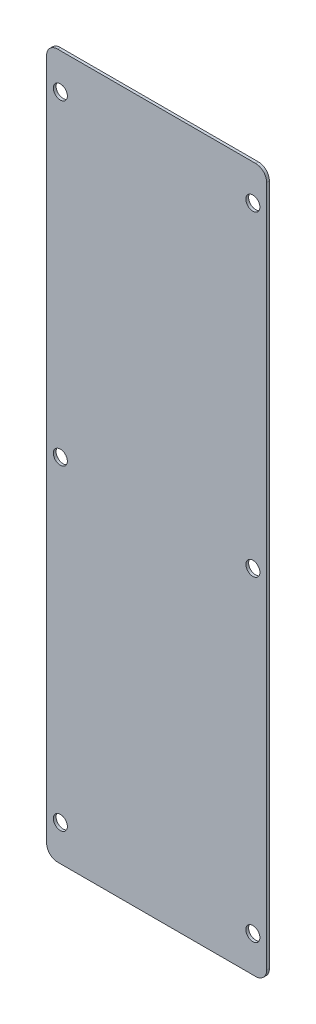
ISO-10303-21;
HEADER;
FILE_DESCRIPTION(('STEP AP214'),'2;1');
FILE_NAME('part.step','',(''),(''),'','','');
FILE_SCHEMA(('AUTOMOTIVE_DESIGN { 1 0 10303 214 1 1 1 1 }'));
ENDSEC;
DATA;
#1=APPLICATION_CONTEXT('core data for automotive mechanical design processes');
#2=APPLICATION_PROTOCOL_DEFINITION('international standard','automotive_design',2000,#1);
#3=PRODUCT_CONTEXT('',#1,'mechanical');
#4=PRODUCT('Part','Part','',(#3));
#5=PRODUCT_RELATED_PRODUCT_CATEGORY('part','',(#4));
#6=PRODUCT_DEFINITION_FORMATION('','',#4);
#7=PRODUCT_DEFINITION_CONTEXT('part definition',#1,'design');
#8=PRODUCT_DEFINITION('design','',#6,#7);
#9=PRODUCT_DEFINITION_SHAPE('','',#8);
#10=(LENGTH_UNIT() NAMED_UNIT(*) SI_UNIT(.MILLI.,.METRE.));
#11=(NAMED_UNIT(*) PLANE_ANGLE_UNIT() SI_UNIT($,.RADIAN.));
#12=(NAMED_UNIT(*) SI_UNIT($,.STERADIAN.) SOLID_ANGLE_UNIT());
#13=UNCERTAINTY_MEASURE_WITH_UNIT(LENGTH_MEASURE(1.E-05),#10,'distance_accuracy_value','');
#14=(GEOMETRIC_REPRESENTATION_CONTEXT(3) GLOBAL_UNCERTAINTY_ASSIGNED_CONTEXT((#13)) GLOBAL_UNIT_ASSIGNED_CONTEXT((#10,
#11,#12)) REPRESENTATION_CONTEXT('',''));
#15=CARTESIAN_POINT('',(0.,0.,0.));
#16=DIRECTION('',(0.,0.,1.));
#17=DIRECTION('',(1.,0.,0.));
#18=AXIS2_PLACEMENT_3D('',#15,#16,#17);
#19=CARTESIAN_POINT('',(40.,-128.,1.));
#20=DIRECTION('',(-1.,0.,0.));
#21=DIRECTION('',(0.,0.,1.));
#22=AXIS2_PLACEMENT_3D('',#19,#20,#21);
#23=PLANE('',#22);
#24=DIRECTION('',(0.,1.,0.));
#25=VECTOR('',#24,1.);
#26=CARTESIAN_POINT('',(40.,-128.,1.));
#27=LINE('',#26,#25);
#28=CARTESIAN_POINT('',(40.,-124.,1.));
#29=VERTEX_POINT('',#28);
#30=CARTESIAN_POINT('',(40.,124.,1.));
#31=VERTEX_POINT('',#30);
#32=EDGE_CURVE('E128',#29,#31,#27,.T.);
#33=ORIENTED_EDGE('',*,*,#32,.F.);
#34=DIRECTION('',(0.,0.,-1.));
#35=VECTOR('',#34,1.);
#36=CARTESIAN_POINT('',(40.,-124.,1.));
#37=LINE('',#36,#35);
#38=CARTESIAN_POINT('',(40.,-124.,0.));
#39=VERTEX_POINT('',#38);
#40=EDGE_CURVE('E11',#29,#39,#37,.T.);
#41=ORIENTED_EDGE('',*,*,#40,.T.);
#42=DIRECTION('',(0.,1.,0.));
#43=VECTOR('',#42,1.);
#44=CARTESIAN_POINT('',(40.,-128.,0.));
#45=LINE('',#44,#43);
#46=CARTESIAN_POINT('',(40.,124.,0.));
#47=VERTEX_POINT('',#46);
#48=EDGE_CURVE('E130',#39,#47,#45,.T.);
#49=ORIENTED_EDGE('',*,*,#48,.T.);
#50=DIRECTION('',(0.,0.,-1.));
#51=VECTOR('',#50,1.);
#52=CARTESIAN_POINT('',(40.,124.,1.));
#53=LINE('',#52,#51);
#54=EDGE_CURVE('E41',#47,#31,#53,.F.);
#55=ORIENTED_EDGE('',*,*,#54,.T.);
#56=EDGE_LOOP('',(#33,#41,#49,#55));
#57=FACE_BOUND('',#56,.T.);
#58=ADVANCED_FACE('F33',(#57),#23,.F.);
#59=CARTESIAN_POINT('',(-40.,128.,1.));
#60=DIRECTION('',(0.,-1.,0.));
#61=DIRECTION('',(0.,0.,-1.));
#62=AXIS2_PLACEMENT_3D('',#59,#60,#61);
#63=PLANE('',#62);
#64=DIRECTION('',(-1.,0.,0.));
#65=VECTOR('',#64,1.);
#66=CARTESIAN_POINT('',(-40.,128.,0.));
#67=LINE('',#66,#65);
#68=CARTESIAN_POINT('',(36.,128.,0.));
#69=VERTEX_POINT('',#68);
#70=CARTESIAN_POINT('',(-36.,128.,0.));
#71=VERTEX_POINT('',#70);
#72=EDGE_CURVE('E126',#69,#71,#67,.T.);
#73=ORIENTED_EDGE('',*,*,#72,.T.);
#74=DIRECTION('',(0.,0.,-1.));
#75=VECTOR('',#74,1.);
#76=CARTESIAN_POINT('',(-36.,128.,1.));
#77=LINE('',#76,#75);
#78=CARTESIAN_POINT('',(-36.,128.,1.));
#79=VERTEX_POINT('',#78);
#80=EDGE_CURVE('E105',#71,#79,#77,.F.);
#81=ORIENTED_EDGE('',*,*,#80,.T.);
#82=DIRECTION('',(-1.,0.,0.));
#83=VECTOR('',#82,1.);
#84=CARTESIAN_POINT('',(-40.,128.,1.));
#85=LINE('',#84,#83);
#86=CARTESIAN_POINT('',(36.,128.,1.));
#87=VERTEX_POINT('',#86);
#88=EDGE_CURVE('E166',#87,#79,#85,.T.);
#89=ORIENTED_EDGE('',*,*,#88,.F.);
#90=DIRECTION('',(0.,0.,-1.));
#91=VECTOR('',#90,1.);
#92=CARTESIAN_POINT('',(36.,128.,1.));
#93=LINE('',#92,#91);
#94=EDGE_CURVE('E110',#87,#69,#93,.T.);
#95=ORIENTED_EDGE('',*,*,#94,.T.);
#96=EDGE_LOOP('',(#73,#81,#89,#95));
#97=FACE_BOUND('',#96,.T.);
#98=ADVANCED_FACE('F170',(#97),#63,.F.);
#99=CARTESIAN_POINT('',(-40.,-128.,1.));
#100=DIRECTION('',(1.,0.,0.));
#101=DIRECTION('',(0.,0.,-1.));
#102=AXIS2_PLACEMENT_3D('',#99,#100,#101);
#103=PLANE('',#102);
#104=DIRECTION('',(0.,-1.,0.));
#105=VECTOR('',#104,1.);
#106=CARTESIAN_POINT('',(-40.,-128.,1.));
#107=LINE('',#106,#105);
#108=CARTESIAN_POINT('',(-40.,124.,1.));
#109=VERTEX_POINT('',#108);
#110=CARTESIAN_POINT('',(-40.,-124.,1.));
#111=VERTEX_POINT('',#110);
#112=EDGE_CURVE('E119',#109,#111,#107,.T.);
#113=ORIENTED_EDGE('',*,*,#112,.F.);
#114=DIRECTION('',(0.,0.,-1.));
#115=VECTOR('',#114,1.);
#116=CARTESIAN_POINT('',(-40.,124.,1.));
#117=LINE('',#116,#115);
#118=CARTESIAN_POINT('',(-40.,124.,0.));
#119=VERTEX_POINT('',#118);
#120=EDGE_CURVE('E104',#109,#119,#117,.T.);
#121=ORIENTED_EDGE('',*,*,#120,.T.);
#122=DIRECTION('',(0.,-1.,0.));
#123=VECTOR('',#122,1.);
#124=CARTESIAN_POINT('',(-40.,-128.,0.));
#125=LINE('',#124,#123);
#126=CARTESIAN_POINT('',(-40.,-124.,0.));
#127=VERTEX_POINT('',#126);
#128=EDGE_CURVE('E117',#119,#127,#125,.T.);
#129=ORIENTED_EDGE('',*,*,#128,.T.);
#130=DIRECTION('',(0.,0.,-1.));
#131=VECTOR('',#130,1.);
#132=CARTESIAN_POINT('',(-40.,-124.,1.));
#133=LINE('',#132,#131);
#134=EDGE_CURVE('E121',#127,#111,#133,.F.);
#135=ORIENTED_EDGE('',*,*,#134,.T.);
#136=EDGE_LOOP('',(#113,#121,#129,#135));
#137=FACE_BOUND('',#136,.T.);
#138=ADVANCED_FACE('F116',(#137),#103,.F.);
#139=CARTESIAN_POINT('',(-40.,-128.,1.));
#140=DIRECTION('',(0.,1.,0.));
#141=DIRECTION('',(0.,0.,1.));
#142=AXIS2_PLACEMENT_3D('',#139,#140,#141);
#143=PLANE('',#142);
#144=DIRECTION('',(1.,0.,0.));
#145=VECTOR('',#144,1.);
#146=CARTESIAN_POINT('',(-40.,-128.,1.));
#147=LINE('',#146,#145);
#148=CARTESIAN_POINT('',(-36.,-128.,1.));
#149=VERTEX_POINT('',#148);
#150=CARTESIAN_POINT('',(36.,-128.,1.));
#151=VERTEX_POINT('',#150);
#152=EDGE_CURVE('E134',#149,#151,#147,.T.);
#153=ORIENTED_EDGE('',*,*,#152,.F.);
#154=DIRECTION('',(0.,0.,-1.));
#155=VECTOR('',#154,1.);
#156=CARTESIAN_POINT('',(-36.,-128.,1.));
#157=LINE('',#156,#155);
#158=CARTESIAN_POINT('',(-36.,-128.,0.));
#159=VERTEX_POINT('',#158);
#160=EDGE_CURVE('E151',#149,#159,#157,.T.);
#161=ORIENTED_EDGE('',*,*,#160,.T.);
#162=DIRECTION('',(1.,0.,0.));
#163=VECTOR('',#162,1.);
#164=CARTESIAN_POINT('',(-40.,-128.,0.));
#165=LINE('',#164,#163);
#166=CARTESIAN_POINT('',(36.,-128.,0.));
#167=VERTEX_POINT('',#166);
#168=EDGE_CURVE('E125',#159,#167,#165,.T.);
#169=ORIENTED_EDGE('',*,*,#168,.T.);
#170=DIRECTION('',(0.,0.,-1.));
#171=VECTOR('',#170,1.);
#172=CARTESIAN_POINT('',(36.,-128.,1.));
#173=LINE('',#172,#171);
#174=EDGE_CURVE('E48',#167,#151,#173,.F.);
#175=ORIENTED_EDGE('',*,*,#174,.T.);
#176=EDGE_LOOP('',(#153,#161,#169,#175));
#177=FACE_BOUND('',#176,.T.);
#178=ADVANCED_FACE('F224',(#177),#143,.F.);
#179=CARTESIAN_POINT('',(0.,0.,1.));
#180=DIRECTION('',(0.,0.,-1.));
#181=DIRECTION('',(-1.,0.,0.));
#182=AXIS2_PLACEMENT_3D('',#179,#180,#181);
#183=PLANE('',#182);
#184=CARTESIAN_POINT('',(-35.0000000000004,-115.,1.));
#185=DIRECTION('',(0.,0.,1.));
#186=DIRECTION('',(1.,0.,0.));
#187=AXIS2_PLACEMENT_3D('',#184,#185,#186);
#188=CIRCLE('',#187,2.55);
#189=CARTESIAN_POINT('',(-32.4500000000004,-115.,1.));
#190=VERTEX_POINT('',#189);
#191=EDGE_CURVE('E201',#190,#190,#188,.T.);
#192=ORIENTED_EDGE('',*,*,#191,.F.);
#193=EDGE_LOOP('',(#192));
#194=FACE_BOUND('',#193,.T.);
#195=CARTESIAN_POINT('',(-35.,1.36830597539016E-13,1.));
#196=DIRECTION('',(0.,0.,1.));
#197=DIRECTION('',(1.,0.,0.));
#198=AXIS2_PLACEMENT_3D('',#195,#196,#197);
#199=CIRCLE('',#198,2.55);
#200=CARTESIAN_POINT('',(-32.45,1.36830597539016E-13,1.));
#201=VERTEX_POINT('',#200);
#202=EDGE_CURVE('E195',#201,#201,#199,.T.);
#203=ORIENTED_EDGE('',*,*,#202,.F.);
#204=EDGE_LOOP('',(#203));
#205=FACE_BOUND('',#204,.T.);
#206=CARTESIAN_POINT('',(35.,-1.16084391434077E-13,1.));
#207=DIRECTION('',(0.,0.,1.));
#208=DIRECTION('',(1.,0.,0.));
#209=AXIS2_PLACEMENT_3D('',#206,#207,#208);
#210=CIRCLE('',#209,2.55);
#211=CARTESIAN_POINT('',(37.55,-1.16084391434077E-13,1.));
#212=VERTEX_POINT('',#211);
#213=EDGE_CURVE('E189',#212,#212,#210,.T.);
#214=ORIENTED_EDGE('',*,*,#213,.F.);
#215=EDGE_LOOP('',(#214));
#216=FACE_BOUND('',#215,.T.);
#217=CARTESIAN_POINT('',(35.0000000000004,115.,1.));
#218=DIRECTION('',(0.,0.,1.));
#219=DIRECTION('',(1.,0.,0.));
#220=AXIS2_PLACEMENT_3D('',#217,#218,#219);
#221=CIRCLE('',#220,2.55);
#222=CARTESIAN_POINT('',(37.5500000000004,115.,1.));
#223=VERTEX_POINT('',#222);
#224=EDGE_CURVE('E182',#223,#223,#221,.T.);
#225=ORIENTED_EDGE('',*,*,#224,.F.);
#226=EDGE_LOOP('',(#225));
#227=FACE_BOUND('',#226,.T.);
#228=CARTESIAN_POINT('',(-34.9999999999996,115.,1.));
#229=DIRECTION('',(0.,0.,1.));
#230=DIRECTION('',(1.,0.,0.));
#231=AXIS2_PLACEMENT_3D('',#228,#229,#230);
#232=CIRCLE('',#231,2.55);
#233=CARTESIAN_POINT('',(-32.4499999999996,115.,1.));
#234=VERTEX_POINT('',#233);
#235=EDGE_CURVE('E206',#234,#234,#232,.T.);
#236=ORIENTED_EDGE('',*,*,#235,.F.);
#237=EDGE_LOOP('',(#236));
#238=FACE_BOUND('',#237,.T.);
#239=CARTESIAN_POINT('',(34.9999999999996,-115.,1.));
#240=DIRECTION('',(0.,0.,1.));
#241=DIRECTION('',(1.,0.,0.));
#242=AXIS2_PLACEMENT_3D('',#239,#240,#241);
#243=CIRCLE('',#242,2.55);
#244=CARTESIAN_POINT('',(37.5499999999996,-115.,1.));
#245=VERTEX_POINT('',#244);
#246=EDGE_CURVE('E173',#245,#245,#243,.T.);
#247=ORIENTED_EDGE('',*,*,#246,.F.);
#248=EDGE_LOOP('',(#247));
#249=FACE_BOUND('',#248,.T.);
#250=ORIENTED_EDGE('',*,*,#88,.T.);
#251=CARTESIAN_POINT('',(-36.,124.,1.));
#252=DIRECTION('',(0.,0.,-1.));
#253=DIRECTION('',(-1.,0.,0.));
#254=AXIS2_PLACEMENT_3D('',#251,#252,#253);
#255=CIRCLE('',#254,4.);
#256=EDGE_CURVE('E148',#79,#109,#255,.F.);
#257=ORIENTED_EDGE('',*,*,#256,.T.);
#258=ORIENTED_EDGE('',*,*,#112,.T.);
#259=CARTESIAN_POINT('',(-36.,-124.,1.));
#260=DIRECTION('',(0.,0.,-1.));
#261=DIRECTION('',(-1.,0.,0.));
#262=AXIS2_PLACEMENT_3D('',#259,#260,#261);
#263=CIRCLE('',#262,4.);
#264=EDGE_CURVE('E55',#111,#149,#263,.F.);
#265=ORIENTED_EDGE('',*,*,#264,.T.);
#266=ORIENTED_EDGE('',*,*,#152,.T.);
#267=CARTESIAN_POINT('',(36.,-124.,1.));
#268=DIRECTION('',(0.,0.,-1.));
#269=DIRECTION('',(-1.,0.,0.));
#270=AXIS2_PLACEMENT_3D('',#267,#268,#269);
#271=CIRCLE('',#270,4.);
#272=EDGE_CURVE('E145',#151,#29,#271,.F.);
#273=ORIENTED_EDGE('',*,*,#272,.T.);
#274=ORIENTED_EDGE('',*,*,#32,.T.);
#275=CARTESIAN_POINT('',(36.,124.,1.));
#276=DIRECTION('',(0.,0.,-1.));
#277=DIRECTION('',(-1.,0.,0.));
#278=AXIS2_PLACEMENT_3D('',#275,#276,#277);
#279=CIRCLE('',#278,4.);
#280=EDGE_CURVE('E143',#31,#87,#279,.F.);
#281=ORIENTED_EDGE('',*,*,#280,.T.);
#282=EDGE_LOOP('',(#250,#257,#258,#265,#266,#273,#274,#281));
#283=FACE_BOUND('',#282,.T.);
#284=ADVANCED_FACE('F163',(#194,#205,#216,#227,#238,#249,#283),#183,.F.);
#285=CARTESIAN_POINT('',(0.,0.,0.));
#286=DIRECTION('',(0.,0.,-1.));
#287=DIRECTION('',(-1.,0.,0.));
#288=AXIS2_PLACEMENT_3D('',#285,#286,#287);
#289=PLANE('',#288);
#290=CARTESIAN_POINT('',(-35.0000000000004,-115.,0.));
#291=DIRECTION('',(0.,0.,1.));
#292=DIRECTION('',(1.,0.,0.));
#293=AXIS2_PLACEMENT_3D('',#290,#291,#292);
#294=CIRCLE('',#293,2.55);
#295=CARTESIAN_POINT('',(-32.4500000000004,-115.,0.));
#296=VERTEX_POINT('',#295);
#297=EDGE_CURVE('E180',#296,#296,#294,.T.);
#298=ORIENTED_EDGE('',*,*,#297,.T.);
#299=EDGE_LOOP('',(#298));
#300=FACE_BOUND('',#299,.T.);
#301=CARTESIAN_POINT('',(-35.,1.36830597539016E-13,0.));
#302=DIRECTION('',(0.,0.,1.));
#303=DIRECTION('',(1.,0.,0.));
#304=AXIS2_PLACEMENT_3D('',#301,#302,#303);
#305=CIRCLE('',#304,2.55);
#306=CARTESIAN_POINT('',(-32.45,1.36830597539016E-13,0.));
#307=VERTEX_POINT('',#306);
#308=EDGE_CURVE('E198',#307,#307,#305,.T.);
#309=ORIENTED_EDGE('',*,*,#308,.T.);
#310=EDGE_LOOP('',(#309));
#311=FACE_BOUND('',#310,.T.);
#312=CARTESIAN_POINT('',(35.,-1.16084391434077E-13,0.));
#313=DIRECTION('',(0.,0.,1.));
#314=DIRECTION('',(1.,0.,0.));
#315=AXIS2_PLACEMENT_3D('',#312,#313,#314);
#316=CIRCLE('',#315,2.55);
#317=CARTESIAN_POINT('',(37.55,-1.16084391434077E-13,0.));
#318=VERTEX_POINT('',#317);
#319=EDGE_CURVE('E192',#318,#318,#316,.T.);
#320=ORIENTED_EDGE('',*,*,#319,.T.);
#321=EDGE_LOOP('',(#320));
#322=FACE_BOUND('',#321,.T.);
#323=CARTESIAN_POINT('',(35.0000000000004,115.,0.));
#324=DIRECTION('',(0.,0.,1.));
#325=DIRECTION('',(1.,0.,0.));
#326=AXIS2_PLACEMENT_3D('',#323,#324,#325);
#327=CIRCLE('',#326,2.55);
#328=CARTESIAN_POINT('',(37.5500000000004,115.,0.));
#329=VERTEX_POINT('',#328);
#330=EDGE_CURVE('E185',#329,#329,#327,.T.);
#331=ORIENTED_EDGE('',*,*,#330,.T.);
#332=EDGE_LOOP('',(#331));
#333=FACE_BOUND('',#332,.T.);
#334=CARTESIAN_POINT('',(-34.9999999999996,115.,0.));
#335=DIRECTION('',(0.,0.,1.));
#336=DIRECTION('',(1.,0.,0.));
#337=AXIS2_PLACEMENT_3D('',#334,#335,#336);
#338=CIRCLE('',#337,2.55);
#339=CARTESIAN_POINT('',(-32.4499999999996,115.,0.));
#340=VERTEX_POINT('',#339);
#341=EDGE_CURVE('E186',#340,#340,#338,.T.);
#342=ORIENTED_EDGE('',*,*,#341,.T.);
#343=EDGE_LOOP('',(#342));
#344=FACE_BOUND('',#343,.T.);
#345=CARTESIAN_POINT('',(34.9999999999996,-115.,0.));
#346=DIRECTION('',(0.,0.,1.));
#347=DIRECTION('',(1.,0.,0.));
#348=AXIS2_PLACEMENT_3D('',#345,#346,#347);
#349=CIRCLE('',#348,2.55);
#350=CARTESIAN_POINT('',(37.5499999999996,-115.,0.));
#351=VERTEX_POINT('',#350);
#352=EDGE_CURVE('E171',#351,#351,#349,.T.);
#353=ORIENTED_EDGE('',*,*,#352,.T.);
#354=EDGE_LOOP('',(#353));
#355=FACE_BOUND('',#354,.T.);
#356=ORIENTED_EDGE('',*,*,#128,.F.);
#357=CARTESIAN_POINT('',(-36.,124.,0.));
#358=DIRECTION('',(0.,0.,-1.));
#359=DIRECTION('',(-1.,0.,0.));
#360=AXIS2_PLACEMENT_3D('',#357,#358,#359);
#361=CIRCLE('',#360,4.);
#362=EDGE_CURVE('E100',#119,#71,#361,.T.);
#363=ORIENTED_EDGE('',*,*,#362,.T.);
#364=ORIENTED_EDGE('',*,*,#72,.F.);
#365=CARTESIAN_POINT('',(36.,124.,0.));
#366=DIRECTION('',(0.,0.,-1.));
#367=DIRECTION('',(-1.,0.,0.));
#368=AXIS2_PLACEMENT_3D('',#365,#366,#367);
#369=CIRCLE('',#368,4.);
#370=EDGE_CURVE('E120',#69,#47,#369,.T.);
#371=ORIENTED_EDGE('',*,*,#370,.T.);
#372=ORIENTED_EDGE('',*,*,#48,.F.);
#373=CARTESIAN_POINT('',(36.,-124.,0.));
#374=DIRECTION('',(0.,0.,-1.));
#375=DIRECTION('',(-1.,0.,0.));
#376=AXIS2_PLACEMENT_3D('',#373,#374,#375);
#377=CIRCLE('',#376,4.);
#378=EDGE_CURVE('E137',#39,#167,#377,.T.);
#379=ORIENTED_EDGE('',*,*,#378,.T.);
#380=ORIENTED_EDGE('',*,*,#168,.F.);
#381=CARTESIAN_POINT('',(-36.,-124.,0.));
#382=DIRECTION('',(0.,0.,-1.));
#383=DIRECTION('',(-1.,0.,0.));
#384=AXIS2_PLACEMENT_3D('',#381,#382,#383);
#385=CIRCLE('',#384,4.);
#386=EDGE_CURVE('E111',#159,#127,#385,.T.);
#387=ORIENTED_EDGE('',*,*,#386,.T.);
#388=EDGE_LOOP('',(#356,#363,#364,#371,#372,#379,#380,#387));
#389=FACE_BOUND('',#388,.T.);
#390=ADVANCED_FACE('F123',(#300,#311,#322,#333,#344,#355,#389),#289,.T.);
#391=CARTESIAN_POINT('',(-36.,124.,1.));
#392=DIRECTION('',(0.,0.,-1.));
#393=DIRECTION('',(-1.,0.,0.));
#394=AXIS2_PLACEMENT_3D('',#391,#392,#393);
#395=CYLINDRICAL_SURFACE('',#394,4.);
#396=ORIENTED_EDGE('',*,*,#256,.F.);
#397=ORIENTED_EDGE('',*,*,#80,.F.);
#398=ORIENTED_EDGE('',*,*,#362,.F.);
#399=ORIENTED_EDGE('',*,*,#120,.F.);
#400=EDGE_LOOP('',(#396,#397,#398,#399));
#401=FACE_BOUND('',#400,.T.);
#402=ADVANCED_FACE('F103',(#401),#395,.T.);
#403=CARTESIAN_POINT('',(-36.,-124.,1.));
#404=DIRECTION('',(0.,0.,-1.));
#405=DIRECTION('',(-1.,0.,0.));
#406=AXIS2_PLACEMENT_3D('',#403,#404,#405);
#407=CYLINDRICAL_SURFACE('',#406,4.);
#408=ORIENTED_EDGE('',*,*,#264,.F.);
#409=ORIENTED_EDGE('',*,*,#134,.F.);
#410=ORIENTED_EDGE('',*,*,#386,.F.);
#411=ORIENTED_EDGE('',*,*,#160,.F.);
#412=EDGE_LOOP('',(#408,#409,#410,#411));
#413=FACE_BOUND('',#412,.T.);
#414=ADVANCED_FACE('F248',(#413),#407,.T.);
#415=CARTESIAN_POINT('',(36.,-124.,1.));
#416=DIRECTION('',(0.,0.,-1.));
#417=DIRECTION('',(-1.,0.,0.));
#418=AXIS2_PLACEMENT_3D('',#415,#416,#417);
#419=CYLINDRICAL_SURFACE('',#418,4.);
#420=ORIENTED_EDGE('',*,*,#272,.F.);
#421=ORIENTED_EDGE('',*,*,#174,.F.);
#422=ORIENTED_EDGE('',*,*,#378,.F.);
#423=ORIENTED_EDGE('',*,*,#40,.F.);
#424=EDGE_LOOP('',(#420,#421,#422,#423));
#425=FACE_BOUND('',#424,.T.);
#426=ADVANCED_FACE('F235',(#425),#419,.T.);
#427=CARTESIAN_POINT('',(36.,124.,1.));
#428=DIRECTION('',(0.,0.,-1.));
#429=DIRECTION('',(-1.,0.,0.));
#430=AXIS2_PLACEMENT_3D('',#427,#428,#429);
#431=CYLINDRICAL_SURFACE('',#430,4.);
#432=ORIENTED_EDGE('',*,*,#280,.F.);
#433=ORIENTED_EDGE('',*,*,#54,.F.);
#434=ORIENTED_EDGE('',*,*,#370,.F.);
#435=ORIENTED_EDGE('',*,*,#94,.F.);
#436=EDGE_LOOP('',(#432,#433,#434,#435));
#437=FACE_BOUND('',#436,.T.);
#438=ADVANCED_FACE('F35',(#437),#431,.T.);
#439=CARTESIAN_POINT('',(34.9999999999996,-115.,0.));
#440=DIRECTION('',(0.,0.,1.));
#441=DIRECTION('',(1.,0.,0.));
#442=AXIS2_PLACEMENT_3D('',#439,#440,#441);
#443=CYLINDRICAL_SURFACE('',#442,2.55);
#444=ORIENTED_EDGE('',*,*,#352,.F.);
#445=EDGE_LOOP('',(#444));
#446=FACE_BOUND('',#445,.T.);
#447=ORIENTED_EDGE('',*,*,#246,.T.);
#448=EDGE_LOOP('',(#447));
#449=FACE_BOUND('',#448,.T.);
#450=ADVANCED_FACE('F218',(#446,#449),#443,.F.);
#451=CARTESIAN_POINT('',(-34.9999999999996,115.,0.));
#452=DIRECTION('',(0.,0.,1.));
#453=DIRECTION('',(1.,0.,0.));
#454=AXIS2_PLACEMENT_3D('',#451,#452,#453);
#455=CYLINDRICAL_SURFACE('',#454,2.55);
#456=ORIENTED_EDGE('',*,*,#341,.F.);
#457=EDGE_LOOP('',(#456));
#458=FACE_BOUND('',#457,.T.);
#459=ORIENTED_EDGE('',*,*,#235,.T.);
#460=EDGE_LOOP('',(#459));
#461=FACE_BOUND('',#460,.T.);
#462=ADVANCED_FACE('F214',(#458,#461),#455,.F.);
#463=CARTESIAN_POINT('',(35.0000000000004,115.,0.));
#464=DIRECTION('',(0.,0.,1.));
#465=DIRECTION('',(1.,0.,0.));
#466=AXIS2_PLACEMENT_3D('',#463,#464,#465);
#467=CYLINDRICAL_SURFACE('',#466,2.55);
#468=ORIENTED_EDGE('',*,*,#330,.F.);
#469=EDGE_LOOP('',(#468));
#470=FACE_BOUND('',#469,.T.);
#471=ORIENTED_EDGE('',*,*,#224,.T.);
#472=EDGE_LOOP('',(#471));
#473=FACE_BOUND('',#472,.T.);
#474=ADVANCED_FACE('F217',(#470,#473),#467,.F.);
#475=CARTESIAN_POINT('',(35.,-1.16084391434077E-13,0.));
#476=DIRECTION('',(0.,0.,1.));
#477=DIRECTION('',(1.,0.,0.));
#478=AXIS2_PLACEMENT_3D('',#475,#476,#477);
#479=CYLINDRICAL_SURFACE('',#478,2.55);
#480=ORIENTED_EDGE('',*,*,#319,.F.);
#481=EDGE_LOOP('',(#480));
#482=FACE_BOUND('',#481,.T.);
#483=ORIENTED_EDGE('',*,*,#213,.T.);
#484=EDGE_LOOP('',(#483));
#485=FACE_BOUND('',#484,.T.);
#486=ADVANCED_FACE('F298',(#482,#485),#479,.F.);
#487=CARTESIAN_POINT('',(-35.,1.36830597539016E-13,0.));
#488=DIRECTION('',(0.,0.,1.));
#489=DIRECTION('',(1.,0.,0.));
#490=AXIS2_PLACEMENT_3D('',#487,#488,#489);
#491=CYLINDRICAL_SURFACE('',#490,2.55);
#492=ORIENTED_EDGE('',*,*,#308,.F.);
#493=EDGE_LOOP('',(#492));
#494=FACE_BOUND('',#493,.T.);
#495=ORIENTED_EDGE('',*,*,#202,.T.);
#496=EDGE_LOOP('',(#495));
#497=FACE_BOUND('',#496,.T.);
#498=ADVANCED_FACE('F307',(#494,#497),#491,.F.);
#499=CARTESIAN_POINT('',(-35.0000000000004,-115.,0.));
#500=DIRECTION('',(0.,0.,1.));
#501=DIRECTION('',(1.,0.,0.));
#502=AXIS2_PLACEMENT_3D('',#499,#500,#501);
#503=CYLINDRICAL_SURFACE('',#502,2.55);
#504=ORIENTED_EDGE('',*,*,#297,.F.);
#505=EDGE_LOOP('',(#504));
#506=FACE_BOUND('',#505,.T.);
#507=ORIENTED_EDGE('',*,*,#191,.T.);
#508=EDGE_LOOP('',(#507));
#509=FACE_BOUND('',#508,.T.);
#510=ADVANCED_FACE('F317',(#506,#509),#503,.F.);
#511=CLOSED_SHELL('',(#58,#98,#138,#178,#284,#390,#402,#414,#426,#438,#450,#462,#474,#486,#498,#510));
#512=MANIFOLD_SOLID_BREP('B2',#511);
#513=ADVANCED_BREP_SHAPE_REPRESENTATION('',(#18,#512),#14);
#514=SHAPE_DEFINITION_REPRESENTATION(#9,#513);
ENDSEC;
END-ISO-10303-21;
